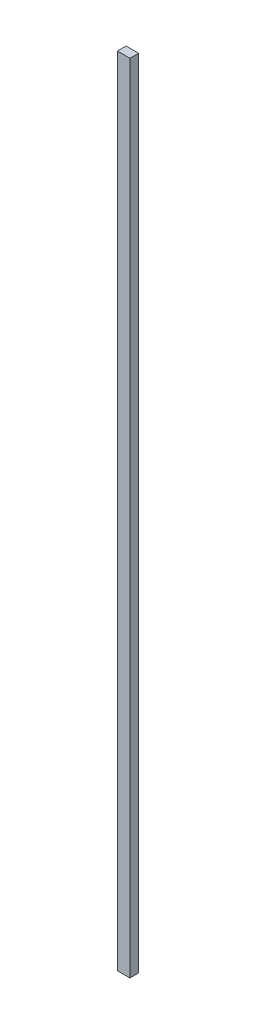
ISO-10303-21;
HEADER;
FILE_DESCRIPTION(('STEP AP214'),'2;1');
FILE_NAME('part.step','',(''),(''),'','','');
FILE_SCHEMA(('AUTOMOTIVE_DESIGN { 1 0 10303 214 1 1 1 1 }'));
ENDSEC;
DATA;
#1=APPLICATION_CONTEXT('core data for automotive mechanical design processes');
#2=APPLICATION_PROTOCOL_DEFINITION('international standard','automotive_design',2000,#1);
#3=PRODUCT_CONTEXT('',#1,'mechanical');
#4=PRODUCT('Part','Part','',(#3));
#5=PRODUCT_RELATED_PRODUCT_CATEGORY('part','',(#4));
#6=PRODUCT_DEFINITION_FORMATION('','',#4);
#7=PRODUCT_DEFINITION_CONTEXT('part definition',#1,'design');
#8=PRODUCT_DEFINITION('design','',#6,#7);
#9=PRODUCT_DEFINITION_SHAPE('','',#8);
#10=(LENGTH_UNIT() NAMED_UNIT(*) SI_UNIT(.MILLI.,.METRE.));
#11=(NAMED_UNIT(*) PLANE_ANGLE_UNIT() SI_UNIT($,.RADIAN.));
#12=(NAMED_UNIT(*) SI_UNIT($,.STERADIAN.) SOLID_ANGLE_UNIT());
#13=UNCERTAINTY_MEASURE_WITH_UNIT(LENGTH_MEASURE(1.E-05),#10,'distance_accuracy_value','');
#14=(GEOMETRIC_REPRESENTATION_CONTEXT(3) GLOBAL_UNCERTAINTY_ASSIGNED_CONTEXT((#13)) GLOBAL_UNIT_ASSIGNED_CONTEXT((#10,
#11,#12)) REPRESENTATION_CONTEXT('',''));
#15=CARTESIAN_POINT('',(0.,0.,0.));
#16=DIRECTION('',(0.,0.,1.));
#17=DIRECTION('',(1.,0.,0.));
#18=AXIS2_PLACEMENT_3D('',#15,#16,#17);
#19=CARTESIAN_POINT('',(-13.7883982207965,89.916,-13.5968480748675));
#20=DIRECTION('',(-1.,0.,0.));
#21=DIRECTION('',(0.,0.,1.));
#22=AXIS2_PLACEMENT_3D('',#19,#20,#21);
#23=PLANE('',#22);
#24=DIRECTION('',(0.,0.,-1.));
#25=VECTOR('',#24,1.);
#26=CARTESIAN_POINT('',(-13.7883982207965,0.,-13.5968480748675));
#27=LINE('',#26,#25);
#28=CARTESIAN_POINT('',(-13.7883982207965,0.,-12.6199846026225));
#29=VERTEX_POINT('',#28);
#30=CARTESIAN_POINT('',(-13.7883982207965,0.,-13.5968480748675));
#31=VERTEX_POINT('',#30);
#32=EDGE_CURVE('E98',#29,#31,#27,.T.);
#33=ORIENTED_EDGE('',*,*,#32,.T.);
#34=DIRECTION('',(0.,-1.,0.));
#35=VECTOR('',#34,1.);
#36=CARTESIAN_POINT('',(-13.7883982207965,89.916,-13.5968480748675));
#37=LINE('',#36,#35);
#38=CARTESIAN_POINT('',(-13.7883982207965,89.916,-13.5968480748675));
#39=VERTEX_POINT('',#38);
#40=EDGE_CURVE('E11',#39,#31,#37,.T.);
#41=ORIENTED_EDGE('',*,*,#40,.F.);
#42=DIRECTION('',(0.,0.,-1.));
#43=VECTOR('',#42,1.);
#44=CARTESIAN_POINT('',(-13.7883982207965,89.916,-13.5968480748675));
#45=LINE('',#44,#43);
#46=CARTESIAN_POINT('',(-13.7883982207965,89.916,-12.6199846026225));
#47=VERTEX_POINT('',#46);
#48=EDGE_CURVE('E86',#47,#39,#45,.T.);
#49=ORIENTED_EDGE('',*,*,#48,.F.);
#50=DIRECTION('',(0.,-1.,0.));
#51=VECTOR('',#50,1.);
#52=CARTESIAN_POINT('',(-13.7883982207965,89.916,-12.6199846026225));
#53=LINE('',#52,#51);
#54=EDGE_CURVE('E94',#47,#29,#53,.T.);
#55=ORIENTED_EDGE('',*,*,#54,.T.);
#56=EDGE_LOOP('',(#33,#41,#49,#55));
#57=FACE_BOUND('',#56,.T.);
#58=ADVANCED_FACE('F35',(#57),#23,.F.);
#59=CARTESIAN_POINT('',(-13.7883982207965,89.916,-13.5968480748675));
#60=DIRECTION('',(0.,0.,1.));
#61=DIRECTION('',(1.,0.,0.));
#62=AXIS2_PLACEMENT_3D('',#59,#60,#61);
#63=PLANE('',#62);
#64=DIRECTION('',(-1.,0.,0.));
#65=VECTOR('',#64,1.);
#66=CARTESIAN_POINT('',(-13.7883982207965,0.,-13.5968480748675));
#67=LINE('',#66,#65);
#68=CARTESIAN_POINT('',(-15.2050774170561,0.,-13.5968480748675));
#69=VERTEX_POINT('',#68);
#70=EDGE_CURVE('E90',#31,#69,#67,.T.);
#71=ORIENTED_EDGE('',*,*,#70,.T.);
#72=DIRECTION('',(0.,-1.,0.));
#73=VECTOR('',#72,1.);
#74=CARTESIAN_POINT('',(-15.2050774170561,89.916,-13.5968480748675));
#75=LINE('',#74,#73);
#76=CARTESIAN_POINT('',(-15.2050774170561,89.916,-13.5968480748675));
#77=VERTEX_POINT('',#76);
#78=EDGE_CURVE('E43',#77,#69,#75,.T.);
#79=ORIENTED_EDGE('',*,*,#78,.F.);
#80=DIRECTION('',(-1.,0.,0.));
#81=VECTOR('',#80,1.);
#82=CARTESIAN_POINT('',(-13.7883982207965,89.916,-13.5968480748675));
#83=LINE('',#82,#81);
#84=EDGE_CURVE('E81',#39,#77,#83,.T.);
#85=ORIENTED_EDGE('',*,*,#84,.F.);
#86=ORIENTED_EDGE('',*,*,#40,.T.);
#87=EDGE_LOOP('',(#71,#79,#85,#86));
#88=FACE_BOUND('',#87,.T.);
#89=ADVANCED_FACE('F89',(#88),#63,.F.);
#90=CARTESIAN_POINT('',(-15.2050774170561,89.916,-13.5968480748675));
#91=DIRECTION('',(1.,0.,0.));
#92=DIRECTION('',(0.,0.,-1.));
#93=AXIS2_PLACEMENT_3D('',#90,#91,#92);
#94=PLANE('',#93);
#95=DIRECTION('',(0.,0.,1.));
#96=VECTOR('',#95,1.);
#97=CARTESIAN_POINT('',(-15.2050774170561,0.,-13.5968480748675));
#98=LINE('',#97,#96);
#99=CARTESIAN_POINT('',(-15.2050774170561,0.,-12.6199846026225));
#100=VERTEX_POINT('',#99);
#101=EDGE_CURVE('E68',#69,#100,#98,.T.);
#102=ORIENTED_EDGE('',*,*,#101,.T.);
#103=DIRECTION('',(0.,-1.,0.));
#104=VECTOR('',#103,1.);
#105=CARTESIAN_POINT('',(-15.2050774170561,89.916,-12.6199846026225));
#106=LINE('',#105,#104);
#107=CARTESIAN_POINT('',(-15.2050774170561,89.916,-12.6199846026225));
#108=VERTEX_POINT('',#107);
#109=EDGE_CURVE('E91',#108,#100,#106,.T.);
#110=ORIENTED_EDGE('',*,*,#109,.F.);
#111=DIRECTION('',(0.,0.,1.));
#112=VECTOR('',#111,1.);
#113=CARTESIAN_POINT('',(-15.2050774170561,89.916,-13.5968480748675));
#114=LINE('',#113,#112);
#115=EDGE_CURVE('E84',#77,#108,#114,.T.);
#116=ORIENTED_EDGE('',*,*,#115,.F.);
#117=ORIENTED_EDGE('',*,*,#78,.T.);
#118=EDGE_LOOP('',(#102,#110,#116,#117));
#119=FACE_BOUND('',#118,.T.);
#120=ADVANCED_FACE('F92',(#119),#94,.F.);
#121=CARTESIAN_POINT('',(-13.7883982207965,89.916,-12.6199846026225));
#122=DIRECTION('',(0.,0.,-1.));
#123=DIRECTION('',(-1.,0.,0.));
#124=AXIS2_PLACEMENT_3D('',#121,#122,#123);
#125=PLANE('',#124);
#126=DIRECTION('',(1.,0.,0.));
#127=VECTOR('',#126,1.);
#128=CARTESIAN_POINT('',(-13.7883982207965,0.,-12.6199846026225));
#129=LINE('',#128,#127);
#130=EDGE_CURVE('E74',#100,#29,#129,.T.);
#131=ORIENTED_EDGE('',*,*,#130,.T.);
#132=ORIENTED_EDGE('',*,*,#54,.F.);
#133=DIRECTION('',(1.,0.,0.));
#134=VECTOR('',#133,1.);
#135=CARTESIAN_POINT('',(-13.7883982207965,89.916,-12.6199846026225));
#136=LINE('',#135,#134);
#137=EDGE_CURVE('E51',#108,#47,#136,.T.);
#138=ORIENTED_EDGE('',*,*,#137,.F.);
#139=ORIENTED_EDGE('',*,*,#109,.T.);
#140=EDGE_LOOP('',(#131,#132,#138,#139));
#141=FACE_BOUND('',#140,.T.);
#142=ADVANCED_FACE('F105',(#141),#125,.F.);
#143=CARTESIAN_POINT('',(0.,89.916,0.));
#144=DIRECTION('',(0.,-1.,0.));
#145=DIRECTION('',(0.,0.,-1.));
#146=AXIS2_PLACEMENT_3D('',#143,#144,#145);
#147=PLANE('',#146);
#148=ORIENTED_EDGE('',*,*,#48,.T.);
#149=ORIENTED_EDGE('',*,*,#84,.T.);
#150=ORIENTED_EDGE('',*,*,#115,.T.);
#151=ORIENTED_EDGE('',*,*,#137,.T.);
#152=EDGE_LOOP('',(#148,#149,#150,#151));
#153=FACE_BOUND('',#152,.T.);
#154=ADVANCED_FACE('F82',(#153),#147,.F.);
#155=CARTESIAN_POINT('',(0.,0.,0.));
#156=DIRECTION('',(0.,-1.,0.));
#157=DIRECTION('',(0.,0.,-1.));
#158=AXIS2_PLACEMENT_3D('',#155,#156,#157);
#159=PLANE('',#158);
#160=ORIENTED_EDGE('',*,*,#32,.F.);
#161=ORIENTED_EDGE('',*,*,#130,.F.);
#162=ORIENTED_EDGE('',*,*,#101,.F.);
#163=ORIENTED_EDGE('',*,*,#70,.F.);
#164=EDGE_LOOP('',(#160,#161,#162,#163));
#165=FACE_BOUND('',#164,.T.);
#166=ADVANCED_FACE('F108',(#165),#159,.T.);
#167=CLOSED_SHELL('',(#58,#89,#120,#142,#154,#166));
#168=MANIFOLD_SOLID_BREP('B2',#167);
#169=ADVANCED_BREP_SHAPE_REPRESENTATION('',(#18,#168),#14);
#170=SHAPE_DEFINITION_REPRESENTATION(#9,#169);
ENDSEC;
END-ISO-10303-21;
